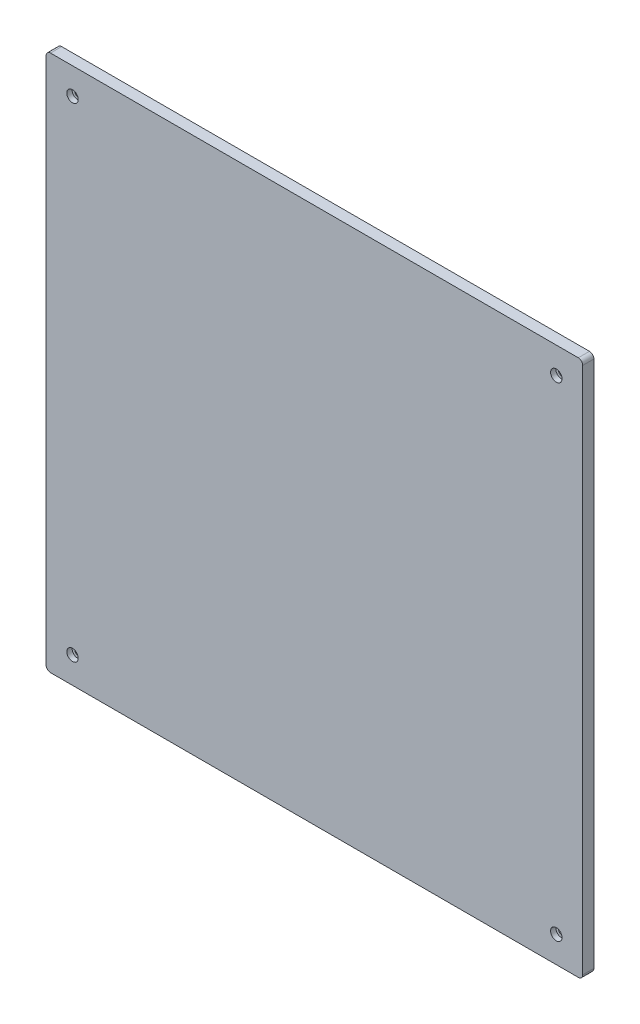
ISO-10303-21;
HEADER;
FILE_DESCRIPTION(('STEP AP214'),'2;1');
FILE_NAME('part.step','',(''),(''),'','','');
FILE_SCHEMA(('AUTOMOTIVE_DESIGN { 1 0 10303 214 1 1 1 1 }'));
ENDSEC;
DATA;
#1=APPLICATION_CONTEXT('core data for automotive mechanical design processes');
#2=APPLICATION_PROTOCOL_DEFINITION('international standard','automotive_design',2000,#1);
#3=PRODUCT_CONTEXT('',#1,'mechanical');
#4=PRODUCT('Part','Part','',(#3));
#5=PRODUCT_RELATED_PRODUCT_CATEGORY('part','',(#4));
#6=PRODUCT_DEFINITION_FORMATION('','',#4);
#7=PRODUCT_DEFINITION_CONTEXT('part definition',#1,'design');
#8=PRODUCT_DEFINITION('design','',#6,#7);
#9=PRODUCT_DEFINITION_SHAPE('','',#8);
#10=(LENGTH_UNIT() NAMED_UNIT(*) SI_UNIT(.MILLI.,.METRE.));
#11=(NAMED_UNIT(*) PLANE_ANGLE_UNIT() SI_UNIT($,.RADIAN.));
#12=(NAMED_UNIT(*) SI_UNIT($,.STERADIAN.) SOLID_ANGLE_UNIT());
#13=UNCERTAINTY_MEASURE_WITH_UNIT(LENGTH_MEASURE(1.E-05),#10,'distance_accuracy_value','');
#14=(GEOMETRIC_REPRESENTATION_CONTEXT(3) GLOBAL_UNCERTAINTY_ASSIGNED_CONTEXT((#13)) GLOBAL_UNIT_ASSIGNED_CONTEXT((#10,
#11,#12)) REPRESENTATION_CONTEXT('',''));
#15=CARTESIAN_POINT('',(0.,0.,0.));
#16=DIRECTION('',(0.,0.,1.));
#17=DIRECTION('',(1.,0.,0.));
#18=AXIS2_PLACEMENT_3D('',#15,#16,#17);
#19=CARTESIAN_POINT('',(152.4,-152.4,6.35));
#20=DIRECTION('',(-1.,0.,0.));
#21=DIRECTION('',(0.,0.,1.));
#22=AXIS2_PLACEMENT_3D('',#19,#20,#21);
#23=PLANE('',#22);
#24=DIRECTION('',(0.,1.,0.));
#25=VECTOR('',#24,1.);
#26=CARTESIAN_POINT('',(152.4,-152.4,0.));
#27=LINE('',#26,#25);
#28=CARTESIAN_POINT('',(152.4,-149.9,0.));
#29=VERTEX_POINT('',#28);
#30=CARTESIAN_POINT('',(152.4,149.9,0.));
#31=VERTEX_POINT('',#30);
#32=EDGE_CURVE('E126',#29,#31,#27,.T.);
#33=ORIENTED_EDGE('',*,*,#32,.T.);
#34=DIRECTION('',(0.,0.,-1.));
#35=VECTOR('',#34,1.);
#36=CARTESIAN_POINT('',(152.4,149.9,6.35));
#37=LINE('',#36,#35);
#38=CARTESIAN_POINT('',(152.4,149.9,6.35));
#39=VERTEX_POINT('',#38);
#40=EDGE_CURVE('E104',#31,#39,#37,.F.);
#41=ORIENTED_EDGE('',*,*,#40,.T.);
#42=DIRECTION('',(0.,1.,0.));
#43=VECTOR('',#42,1.);
#44=CARTESIAN_POINT('',(152.4,-152.4,6.35));
#45=LINE('',#44,#43);
#46=CARTESIAN_POINT('',(152.4,-149.9,6.35));
#47=VERTEX_POINT('',#46);
#48=EDGE_CURVE('E136',#47,#39,#45,.T.);
#49=ORIENTED_EDGE('',*,*,#48,.F.);
#50=DIRECTION('',(0.,0.,-1.));
#51=VECTOR('',#50,1.);
#52=CARTESIAN_POINT('',(152.4,-149.9,6.35));
#53=LINE('',#52,#51);
#54=EDGE_CURVE('E109',#47,#29,#53,.T.);
#55=ORIENTED_EDGE('',*,*,#54,.T.);
#56=EDGE_LOOP('',(#33,#41,#49,#55));
#57=FACE_BOUND('',#56,.T.);
#58=ADVANCED_FACE('F33',(#57),#23,.F.);
#59=CARTESIAN_POINT('',(-152.4,152.4,6.35));
#60=DIRECTION('',(0.,-1.,0.));
#61=DIRECTION('',(0.,0.,-1.));
#62=AXIS2_PLACEMENT_3D('',#59,#60,#61);
#63=PLANE('',#62);
#64=DIRECTION('',(-1.,0.,0.));
#65=VECTOR('',#64,1.);
#66=CARTESIAN_POINT('',(-152.4,152.4,6.35));
#67=LINE('',#66,#65);
#68=CARTESIAN_POINT('',(149.9,152.4,6.35));
#69=VERTEX_POINT('',#68);
#70=CARTESIAN_POINT('',(-149.9,152.4,6.35));
#71=VERTEX_POINT('',#70);
#72=EDGE_CURVE('E119',#69,#71,#67,.T.);
#73=ORIENTED_EDGE('',*,*,#72,.F.);
#74=DIRECTION('',(0.,0.,-1.));
#75=VECTOR('',#74,1.);
#76=CARTESIAN_POINT('',(149.9,152.4,6.35));
#77=LINE('',#76,#75);
#78=CARTESIAN_POINT('',(149.9,152.4,0.));
#79=VERTEX_POINT('',#78);
#80=EDGE_CURVE('E103',#69,#79,#77,.T.);
#81=ORIENTED_EDGE('',*,*,#80,.T.);
#82=DIRECTION('',(-1.,0.,0.));
#83=VECTOR('',#82,1.);
#84=CARTESIAN_POINT('',(-152.4,152.4,0.));
#85=LINE('',#84,#83);
#86=CARTESIAN_POINT('',(-149.9,152.4,0.));
#87=VERTEX_POINT('',#86);
#88=EDGE_CURVE('E116',#79,#87,#85,.T.);
#89=ORIENTED_EDGE('',*,*,#88,.T.);
#90=DIRECTION('',(0.,0.,-1.));
#91=VECTOR('',#90,1.);
#92=CARTESIAN_POINT('',(-149.9,152.4,6.35));
#93=LINE('',#92,#91);
#94=EDGE_CURVE('E121',#87,#71,#93,.F.);
#95=ORIENTED_EDGE('',*,*,#94,.T.);
#96=EDGE_LOOP('',(#73,#81,#89,#95));
#97=FACE_BOUND('',#96,.T.);
#98=ADVANCED_FACE('F115',(#97),#63,.F.);
#99=CARTESIAN_POINT('',(-152.4,-152.4,6.35));
#100=DIRECTION('',(1.,0.,0.));
#101=DIRECTION('',(0.,0.,-1.));
#102=AXIS2_PLACEMENT_3D('',#99,#100,#101);
#103=PLANE('',#102);
#104=DIRECTION('',(0.,-1.,0.));
#105=VECTOR('',#104,1.);
#106=CARTESIAN_POINT('',(-152.4,-152.4,0.));
#107=LINE('',#106,#105);
#108=CARTESIAN_POINT('',(-152.4,149.9,0.));
#109=VERTEX_POINT('',#108);
#110=CARTESIAN_POINT('',(-152.4,-149.9,0.));
#111=VERTEX_POINT('',#110);
#112=EDGE_CURVE('E125',#109,#111,#107,.T.);
#113=ORIENTED_EDGE('',*,*,#112,.T.);
#114=DIRECTION('',(0.,0.,-1.));
#115=VECTOR('',#114,1.);
#116=CARTESIAN_POINT('',(-152.4,-149.9,6.35));
#117=LINE('',#116,#115);
#118=CARTESIAN_POINT('',(-152.4,-149.9,6.35));
#119=VERTEX_POINT('',#118);
#120=EDGE_CURVE('E11',#111,#119,#117,.F.);
#121=ORIENTED_EDGE('',*,*,#120,.T.);
#122=DIRECTION('',(0.,-1.,0.));
#123=VECTOR('',#122,1.);
#124=CARTESIAN_POINT('',(-152.4,-152.4,6.35));
#125=LINE('',#124,#123);
#126=CARTESIAN_POINT('',(-152.4,149.9,6.35));
#127=VERTEX_POINT('',#126);
#128=EDGE_CURVE('E162',#127,#119,#125,.T.);
#129=ORIENTED_EDGE('',*,*,#128,.F.);
#130=DIRECTION('',(0.,0.,-1.));
#131=VECTOR('',#130,1.);
#132=CARTESIAN_POINT('',(-152.4,149.9,6.35));
#133=LINE('',#132,#131);
#134=EDGE_CURVE('E41',#127,#109,#133,.T.);
#135=ORIENTED_EDGE('',*,*,#134,.T.);
#136=EDGE_LOOP('',(#113,#121,#129,#135));
#137=FACE_BOUND('',#136,.T.);
#138=ADVANCED_FACE('F160',(#137),#103,.F.);
#139=CARTESIAN_POINT('',(-152.4,-152.4,6.35));
#140=DIRECTION('',(0.,1.,0.));
#141=DIRECTION('',(0.,0.,1.));
#142=AXIS2_PLACEMENT_3D('',#139,#140,#141);
#143=PLANE('',#142);
#144=DIRECTION('',(1.,0.,0.));
#145=VECTOR('',#144,1.);
#146=CARTESIAN_POINT('',(-152.4,-152.4,0.));
#147=LINE('',#146,#145);
#148=CARTESIAN_POINT('',(-149.9,-152.4,0.));
#149=VERTEX_POINT('',#148);
#150=CARTESIAN_POINT('',(149.9,-152.4,0.));
#151=VERTEX_POINT('',#150);
#152=EDGE_CURVE('E129',#149,#151,#147,.T.);
#153=ORIENTED_EDGE('',*,*,#152,.T.);
#154=DIRECTION('',(0.,0.,-1.));
#155=VECTOR('',#154,1.);
#156=CARTESIAN_POINT('',(149.9,-152.4,6.35));
#157=LINE('',#156,#155);
#158=CARTESIAN_POINT('',(149.9,-152.4,6.35));
#159=VERTEX_POINT('',#158);
#160=EDGE_CURVE('E48',#151,#159,#157,.F.);
#161=ORIENTED_EDGE('',*,*,#160,.T.);
#162=DIRECTION('',(1.,0.,0.));
#163=VECTOR('',#162,1.);
#164=CARTESIAN_POINT('',(-152.4,-152.4,6.35));
#165=LINE('',#164,#163);
#166=CARTESIAN_POINT('',(-149.9,-152.4,6.35));
#167=VERTEX_POINT('',#166);
#168=EDGE_CURVE('E137',#167,#159,#165,.T.);
#169=ORIENTED_EDGE('',*,*,#168,.F.);
#170=DIRECTION('',(0.,0.,-1.));
#171=VECTOR('',#170,1.);
#172=CARTESIAN_POINT('',(-149.9,-152.4,6.35));
#173=LINE('',#172,#171);
#174=EDGE_CURVE('E153',#167,#149,#173,.T.);
#175=ORIENTED_EDGE('',*,*,#174,.T.);
#176=EDGE_LOOP('',(#153,#161,#169,#175));
#177=FACE_BOUND('',#176,.T.);
#178=ADVANCED_FACE('F169',(#177),#143,.F.);
#179=CARTESIAN_POINT('',(0.,0.,6.35));
#180=DIRECTION('',(0.,0.,-1.));
#181=DIRECTION('',(-1.,0.,0.));
#182=AXIS2_PLACEMENT_3D('',#179,#180,#181);
#183=PLANE('',#182);
#184=CARTESIAN_POINT('',(137.4,137.4,6.35));
#185=DIRECTION('',(0.,0.,1.));
#186=DIRECTION('',(1.,0.,0.));
#187=AXIS2_PLACEMENT_3D('',#184,#185,#186);
#188=CIRCLE('',#187,3.25);
#189=CARTESIAN_POINT('',(140.65,137.4,6.35));
#190=VERTEX_POINT('',#189);
#191=EDGE_CURVE('E220',#190,#190,#188,.T.);
#192=ORIENTED_EDGE('',*,*,#191,.F.);
#193=EDGE_LOOP('',(#192));
#194=FACE_BOUND('',#193,.T.);
#195=CARTESIAN_POINT('',(-137.4,-137.4,6.35));
#196=DIRECTION('',(0.,0.,1.));
#197=DIRECTION('',(1.,0.,0.));
#198=AXIS2_PLACEMENT_3D('',#195,#196,#197);
#199=CIRCLE('',#198,3.25);
#200=CARTESIAN_POINT('',(-134.15,-137.4,6.35));
#201=VERTEX_POINT('',#200);
#202=EDGE_CURVE('E208',#201,#201,#199,.T.);
#203=ORIENTED_EDGE('',*,*,#202,.F.);
#204=EDGE_LOOP('',(#203));
#205=FACE_BOUND('',#204,.T.);
#206=CARTESIAN_POINT('',(137.4,-137.4,6.35));
#207=DIRECTION('',(0.,0.,1.));
#208=DIRECTION('',(1.,0.,0.));
#209=AXIS2_PLACEMENT_3D('',#206,#207,#208);
#210=CIRCLE('',#209,3.25);
#211=CARTESIAN_POINT('',(140.65,-137.4,6.35));
#212=VERTEX_POINT('',#211);
#213=EDGE_CURVE('E196',#212,#212,#210,.T.);
#214=ORIENTED_EDGE('',*,*,#213,.F.);
#215=EDGE_LOOP('',(#214));
#216=FACE_BOUND('',#215,.T.);
#217=CARTESIAN_POINT('',(-137.4,137.4,6.35));
#218=DIRECTION('',(0.,0.,1.));
#219=DIRECTION('',(1.,0.,0.));
#220=AXIS2_PLACEMENT_3D('',#217,#218,#219);
#221=CIRCLE('',#220,3.25);
#222=CARTESIAN_POINT('',(-134.15,137.4,6.35));
#223=VERTEX_POINT('',#222);
#224=EDGE_CURVE('E184',#223,#223,#221,.T.);
#225=ORIENTED_EDGE('',*,*,#224,.F.);
#226=EDGE_LOOP('',(#225));
#227=FACE_BOUND('',#226,.T.);
#228=ORIENTED_EDGE('',*,*,#48,.T.);
#229=CARTESIAN_POINT('',(149.9,149.9,6.35));
#230=DIRECTION('',(0.,0.,-1.));
#231=DIRECTION('',(-1.,0.,0.));
#232=AXIS2_PLACEMENT_3D('',#229,#230,#231);
#233=CIRCLE('',#232,2.5);
#234=EDGE_CURVE('E151',#39,#69,#233,.F.);
#235=ORIENTED_EDGE('',*,*,#234,.T.);
#236=ORIENTED_EDGE('',*,*,#72,.T.);
#237=CARTESIAN_POINT('',(-149.9,149.9,6.35));
#238=DIRECTION('',(0.,0.,-1.));
#239=DIRECTION('',(-1.,0.,0.));
#240=AXIS2_PLACEMENT_3D('',#237,#238,#239);
#241=CIRCLE('',#240,2.5);
#242=EDGE_CURVE('E146',#71,#127,#241,.F.);
#243=ORIENTED_EDGE('',*,*,#242,.T.);
#244=ORIENTED_EDGE('',*,*,#128,.T.);
#245=CARTESIAN_POINT('',(-149.9,-149.9,6.35));
#246=DIRECTION('',(0.,0.,-1.));
#247=DIRECTION('',(-1.,0.,0.));
#248=AXIS2_PLACEMENT_3D('',#245,#246,#247);
#249=CIRCLE('',#248,2.5);
#250=EDGE_CURVE('E55',#119,#167,#249,.F.);
#251=ORIENTED_EDGE('',*,*,#250,.T.);
#252=ORIENTED_EDGE('',*,*,#168,.T.);
#253=CARTESIAN_POINT('',(149.9,-149.9,6.35));
#254=DIRECTION('',(0.,0.,-1.));
#255=DIRECTION('',(-1.,0.,0.));
#256=AXIS2_PLACEMENT_3D('',#253,#254,#255);
#257=CIRCLE('',#256,2.5);
#258=EDGE_CURVE('E149',#159,#47,#257,.F.);
#259=ORIENTED_EDGE('',*,*,#258,.T.);
#260=EDGE_LOOP('',(#228,#235,#236,#243,#244,#251,#252,#259));
#261=FACE_BOUND('',#260,.T.);
#262=ADVANCED_FACE('F226',(#194,#205,#216,#227,#261),#183,.F.);
#263=CARTESIAN_POINT('',(0.,0.,0.));
#264=DIRECTION('',(0.,0.,-1.));
#265=DIRECTION('',(-1.,0.,0.));
#266=AXIS2_PLACEMENT_3D('',#263,#264,#265);
#267=PLANE('',#266);
#268=CARTESIAN_POINT('',(137.4,137.4,0.));
#269=DIRECTION('',(0.,0.,-1.));
#270=DIRECTION('',(-1.,0.,0.));
#271=AXIS2_PLACEMENT_3D('',#268,#269,#270);
#272=CIRCLE('',#271,1.70000000000001);
#273=CARTESIAN_POINT('',(135.7,137.4,0.));
#274=VERTEX_POINT('',#273);
#275=EDGE_CURVE('E211',#274,#274,#272,.T.);
#276=ORIENTED_EDGE('',*,*,#275,.F.);
#277=EDGE_LOOP('',(#276));
#278=FACE_BOUND('',#277,.T.);
#279=CARTESIAN_POINT('',(-137.4,-137.4,0.));
#280=DIRECTION('',(0.,0.,-1.));
#281=DIRECTION('',(-1.,0.,0.));
#282=AXIS2_PLACEMENT_3D('',#279,#280,#281);
#283=CIRCLE('',#282,1.70000000000001);
#284=CARTESIAN_POINT('',(-139.1,-137.4,0.));
#285=VERTEX_POINT('',#284);
#286=EDGE_CURVE('E199',#285,#285,#283,.T.);
#287=ORIENTED_EDGE('',*,*,#286,.F.);
#288=EDGE_LOOP('',(#287));
#289=FACE_BOUND('',#288,.T.);
#290=CARTESIAN_POINT('',(137.4,-137.4,0.));
#291=DIRECTION('',(0.,0.,-1.));
#292=DIRECTION('',(-1.,0.,0.));
#293=AXIS2_PLACEMENT_3D('',#290,#291,#292);
#294=CIRCLE('',#293,1.70000000000001);
#295=CARTESIAN_POINT('',(135.7,-137.4,0.));
#296=VERTEX_POINT('',#295);
#297=EDGE_CURVE('E187',#296,#296,#294,.T.);
#298=ORIENTED_EDGE('',*,*,#297,.F.);
#299=EDGE_LOOP('',(#298));
#300=FACE_BOUND('',#299,.T.);
#301=CARTESIAN_POINT('',(-137.4,137.4,0.));
#302=DIRECTION('',(0.,0.,-1.));
#303=DIRECTION('',(-1.,0.,0.));
#304=AXIS2_PLACEMENT_3D('',#301,#302,#303);
#305=CIRCLE('',#304,1.70000000000001);
#306=CARTESIAN_POINT('',(-139.1,137.4,0.));
#307=VERTEX_POINT('',#306);
#308=EDGE_CURVE('E131',#307,#307,#305,.T.);
#309=ORIENTED_EDGE('',*,*,#308,.F.);
#310=EDGE_LOOP('',(#309));
#311=FACE_BOUND('',#310,.T.);
#312=ORIENTED_EDGE('',*,*,#88,.F.);
#313=CARTESIAN_POINT('',(149.9,149.9,0.));
#314=DIRECTION('',(0.,0.,-1.));
#315=DIRECTION('',(-1.,0.,0.));
#316=AXIS2_PLACEMENT_3D('',#313,#314,#315);
#317=CIRCLE('',#316,2.5);
#318=EDGE_CURVE('E99',#79,#31,#317,.T.);
#319=ORIENTED_EDGE('',*,*,#318,.T.);
#320=ORIENTED_EDGE('',*,*,#32,.F.);
#321=CARTESIAN_POINT('',(149.9,-149.9,0.));
#322=DIRECTION('',(0.,0.,-1.));
#323=DIRECTION('',(-1.,0.,0.));
#324=AXIS2_PLACEMENT_3D('',#321,#322,#323);
#325=CIRCLE('',#324,2.5);
#326=EDGE_CURVE('E110',#29,#151,#325,.T.);
#327=ORIENTED_EDGE('',*,*,#326,.T.);
#328=ORIENTED_EDGE('',*,*,#152,.F.);
#329=CARTESIAN_POINT('',(-149.9,-149.9,0.));
#330=DIRECTION('',(0.,0.,-1.));
#331=DIRECTION('',(-1.,0.,0.));
#332=AXIS2_PLACEMENT_3D('',#329,#330,#331);
#333=CIRCLE('',#332,2.5);
#334=EDGE_CURVE('E140',#149,#111,#333,.T.);
#335=ORIENTED_EDGE('',*,*,#334,.T.);
#336=ORIENTED_EDGE('',*,*,#112,.F.);
#337=CARTESIAN_POINT('',(-149.9,149.9,0.));
#338=DIRECTION('',(0.,0.,-1.));
#339=DIRECTION('',(-1.,0.,0.));
#340=AXIS2_PLACEMENT_3D('',#337,#338,#339);
#341=CIRCLE('',#340,2.5);
#342=EDGE_CURVE('E120',#109,#87,#341,.T.);
#343=ORIENTED_EDGE('',*,*,#342,.T.);
#344=EDGE_LOOP('',(#312,#319,#320,#327,#328,#335,#336,#343));
#345=FACE_BOUND('',#344,.T.);
#346=ADVANCED_FACE('F123',(#278,#289,#300,#311,#345),#267,.T.);
#347=CARTESIAN_POINT('',(-137.4,137.4,6.35));
#348=DIRECTION('',(0.,0.,1.));
#349=DIRECTION('',(1.,0.,0.));
#350=AXIS2_PLACEMENT_3D('',#347,#348,#349);
#351=CYLINDRICAL_SURFACE('',#350,1.70000000000001);
#352=CARTESIAN_POINT('',(-137.4,137.4,3.35));
#353=DIRECTION('',(0.,0.,1.));
#354=DIRECTION('',(1.,0.,0.));
#355=AXIS2_PLACEMENT_3D('',#352,#353,#354);
#356=CIRCLE('',#355,1.70000000000001);
#357=CARTESIAN_POINT('',(-135.7,137.4,3.35));
#358=VERTEX_POINT('',#357);
#359=EDGE_CURVE('E178',#358,#358,#356,.T.);
#360=ORIENTED_EDGE('',*,*,#359,.T.);
#361=EDGE_LOOP('',(#360));
#362=FACE_BOUND('',#361,.T.);
#363=ORIENTED_EDGE('',*,*,#308,.T.);
#364=EDGE_LOOP('',(#363));
#365=FACE_BOUND('',#364,.T.);
#366=ADVANCED_FACE('F260',(#362,#365),#351,.F.);
#367=CARTESIAN_POINT('',(-135.7,137.4,3.35));
#368=DIRECTION('',(0.,0.,-1.));
#369=DIRECTION('',(-1.,0.,0.));
#370=AXIS2_PLACEMENT_3D('',#367,#368,#369);
#371=PLANE('',#370);
#372=ORIENTED_EDGE('',*,*,#359,.F.);
#373=EDGE_LOOP('',(#372));
#374=FACE_BOUND('',#373,.T.);
#375=CARTESIAN_POINT('',(-137.4,137.4,3.35));
#376=DIRECTION('',(0.,0.,1.));
#377=DIRECTION('',(1.,0.,0.));
#378=AXIS2_PLACEMENT_3D('',#375,#376,#377);
#379=CIRCLE('',#378,3.25);
#380=CARTESIAN_POINT('',(-134.15,137.4,3.35));
#381=VERTEX_POINT('',#380);
#382=EDGE_CURVE('E181',#381,#381,#379,.T.);
#383=ORIENTED_EDGE('',*,*,#382,.T.);
#384=EDGE_LOOP('',(#383));
#385=FACE_BOUND('',#384,.T.);
#386=ADVANCED_FACE('F265',(#374,#385),#371,.F.);
#387=CARTESIAN_POINT('',(-137.4,137.4,6.35));
#388=DIRECTION('',(0.,0.,1.));
#389=DIRECTION('',(1.,0.,0.));
#390=AXIS2_PLACEMENT_3D('',#387,#388,#389);
#391=CYLINDRICAL_SURFACE('',#390,3.25);
#392=ORIENTED_EDGE('',*,*,#382,.F.);
#393=EDGE_LOOP('',(#392));
#394=FACE_BOUND('',#393,.T.);
#395=ORIENTED_EDGE('',*,*,#224,.T.);
#396=EDGE_LOOP('',(#395));
#397=FACE_BOUND('',#396,.T.);
#398=ADVANCED_FACE('F269',(#394,#397),#391,.F.);
#399=CARTESIAN_POINT('',(137.4,-137.4,6.35));
#400=DIRECTION('',(0.,0.,1.));
#401=DIRECTION('',(1.,0.,0.));
#402=AXIS2_PLACEMENT_3D('',#399,#400,#401);
#403=CYLINDRICAL_SURFACE('',#402,1.70000000000001);
#404=CARTESIAN_POINT('',(137.4,-137.4,3.35));
#405=DIRECTION('',(0.,0.,1.));
#406=DIRECTION('',(1.,0.,0.));
#407=AXIS2_PLACEMENT_3D('',#404,#405,#406);
#408=CIRCLE('',#407,1.70000000000001);
#409=CARTESIAN_POINT('',(139.1,-137.4,3.35));
#410=VERTEX_POINT('',#409);
#411=EDGE_CURVE('E190',#410,#410,#408,.T.);
#412=ORIENTED_EDGE('',*,*,#411,.T.);
#413=EDGE_LOOP('',(#412));
#414=FACE_BOUND('',#413,.T.);
#415=ORIENTED_EDGE('',*,*,#297,.T.);
#416=EDGE_LOOP('',(#415));
#417=FACE_BOUND('',#416,.T.);
#418=ADVANCED_FACE('F273',(#414,#417),#403,.F.);
#419=CARTESIAN_POINT('',(139.1,-137.4,3.35));
#420=DIRECTION('',(0.,0.,-1.));
#421=DIRECTION('',(-1.,0.,0.));
#422=AXIS2_PLACEMENT_3D('',#419,#420,#421);
#423=PLANE('',#422);
#424=ORIENTED_EDGE('',*,*,#411,.F.);
#425=EDGE_LOOP('',(#424));
#426=FACE_BOUND('',#425,.T.);
#427=CARTESIAN_POINT('',(137.4,-137.4,3.35));
#428=DIRECTION('',(0.,0.,1.));
#429=DIRECTION('',(1.,0.,0.));
#430=AXIS2_PLACEMENT_3D('',#427,#428,#429);
#431=CIRCLE('',#430,3.25);
#432=CARTESIAN_POINT('',(140.65,-137.4,3.35));
#433=VERTEX_POINT('',#432);
#434=EDGE_CURVE('E193',#433,#433,#431,.T.);
#435=ORIENTED_EDGE('',*,*,#434,.T.);
#436=EDGE_LOOP('',(#435));
#437=FACE_BOUND('',#436,.T.);
#438=ADVANCED_FACE('F277',(#426,#437),#423,.F.);
#439=CARTESIAN_POINT('',(137.4,-137.4,6.35));
#440=DIRECTION('',(0.,0.,1.));
#441=DIRECTION('',(1.,0.,0.));
#442=AXIS2_PLACEMENT_3D('',#439,#440,#441);
#443=CYLINDRICAL_SURFACE('',#442,3.25);
#444=ORIENTED_EDGE('',*,*,#434,.F.);
#445=EDGE_LOOP('',(#444));
#446=FACE_BOUND('',#445,.T.);
#447=ORIENTED_EDGE('',*,*,#213,.T.);
#448=EDGE_LOOP('',(#447));
#449=FACE_BOUND('',#448,.T.);
#450=ADVANCED_FACE('F281',(#446,#449),#443,.F.);
#451=CARTESIAN_POINT('',(-137.4,-137.4,6.35));
#452=DIRECTION('',(0.,0.,1.));
#453=DIRECTION('',(1.,0.,0.));
#454=AXIS2_PLACEMENT_3D('',#451,#452,#453);
#455=CYLINDRICAL_SURFACE('',#454,1.70000000000001);
#456=CARTESIAN_POINT('',(-137.4,-137.4,3.35));
#457=DIRECTION('',(0.,0.,1.));
#458=DIRECTION('',(1.,0.,0.));
#459=AXIS2_PLACEMENT_3D('',#456,#457,#458);
#460=CIRCLE('',#459,1.70000000000001);
#461=CARTESIAN_POINT('',(-135.7,-137.4,3.35));
#462=VERTEX_POINT('',#461);
#463=EDGE_CURVE('E202',#462,#462,#460,.T.);
#464=ORIENTED_EDGE('',*,*,#463,.T.);
#465=EDGE_LOOP('',(#464));
#466=FACE_BOUND('',#465,.T.);
#467=ORIENTED_EDGE('',*,*,#286,.T.);
#468=EDGE_LOOP('',(#467));
#469=FACE_BOUND('',#468,.T.);
#470=ADVANCED_FACE('F285',(#466,#469),#455,.F.);
#471=CARTESIAN_POINT('',(-135.7,-137.4,3.35));
#472=DIRECTION('',(0.,0.,-1.));
#473=DIRECTION('',(-1.,0.,0.));
#474=AXIS2_PLACEMENT_3D('',#471,#472,#473);
#475=PLANE('',#474);
#476=ORIENTED_EDGE('',*,*,#463,.F.);
#477=EDGE_LOOP('',(#476));
#478=FACE_BOUND('',#477,.T.);
#479=CARTESIAN_POINT('',(-137.4,-137.4,3.35));
#480=DIRECTION('',(0.,0.,1.));
#481=DIRECTION('',(1.,0.,0.));
#482=AXIS2_PLACEMENT_3D('',#479,#480,#481);
#483=CIRCLE('',#482,3.25);
#484=CARTESIAN_POINT('',(-134.15,-137.4,3.35));
#485=VERTEX_POINT('',#484);
#486=EDGE_CURVE('E205',#485,#485,#483,.T.);
#487=ORIENTED_EDGE('',*,*,#486,.T.);
#488=EDGE_LOOP('',(#487));
#489=FACE_BOUND('',#488,.T.);
#490=ADVANCED_FACE('F289',(#478,#489),#475,.F.);
#491=CARTESIAN_POINT('',(-137.4,-137.4,6.35));
#492=DIRECTION('',(0.,0.,1.));
#493=DIRECTION('',(1.,0.,0.));
#494=AXIS2_PLACEMENT_3D('',#491,#492,#493);
#495=CYLINDRICAL_SURFACE('',#494,3.25);
#496=ORIENTED_EDGE('',*,*,#486,.F.);
#497=EDGE_LOOP('',(#496));
#498=FACE_BOUND('',#497,.T.);
#499=ORIENTED_EDGE('',*,*,#202,.T.);
#500=EDGE_LOOP('',(#499));
#501=FACE_BOUND('',#500,.T.);
#502=ADVANCED_FACE('F293',(#498,#501),#495,.F.);
#503=CARTESIAN_POINT('',(137.4,137.4,6.35));
#504=DIRECTION('',(0.,0.,1.));
#505=DIRECTION('',(1.,0.,0.));
#506=AXIS2_PLACEMENT_3D('',#503,#504,#505);
#507=CYLINDRICAL_SURFACE('',#506,1.70000000000001);
#508=CARTESIAN_POINT('',(137.4,137.4,3.35));
#509=DIRECTION('',(0.,0.,1.));
#510=DIRECTION('',(1.,0.,0.));
#511=AXIS2_PLACEMENT_3D('',#508,#509,#510);
#512=CIRCLE('',#511,1.70000000000001);
#513=CARTESIAN_POINT('',(139.1,137.4,3.35));
#514=VERTEX_POINT('',#513);
#515=EDGE_CURVE('E214',#514,#514,#512,.T.);
#516=ORIENTED_EDGE('',*,*,#515,.T.);
#517=EDGE_LOOP('',(#516));
#518=FACE_BOUND('',#517,.T.);
#519=ORIENTED_EDGE('',*,*,#275,.T.);
#520=EDGE_LOOP('',(#519));
#521=FACE_BOUND('',#520,.T.);
#522=ADVANCED_FACE('F297',(#518,#521),#507,.F.);
#523=CARTESIAN_POINT('',(139.1,137.4,3.35));
#524=DIRECTION('',(0.,0.,-1.));
#525=DIRECTION('',(-1.,0.,0.));
#526=AXIS2_PLACEMENT_3D('',#523,#524,#525);
#527=PLANE('',#526);
#528=ORIENTED_EDGE('',*,*,#515,.F.);
#529=EDGE_LOOP('',(#528));
#530=FACE_BOUND('',#529,.T.);
#531=CARTESIAN_POINT('',(137.4,137.4,3.35));
#532=DIRECTION('',(0.,0.,1.));
#533=DIRECTION('',(1.,0.,0.));
#534=AXIS2_PLACEMENT_3D('',#531,#532,#533);
#535=CIRCLE('',#534,3.25);
#536=CARTESIAN_POINT('',(140.65,137.4,3.35));
#537=VERTEX_POINT('',#536);
#538=EDGE_CURVE('E217',#537,#537,#535,.T.);
#539=ORIENTED_EDGE('',*,*,#538,.T.);
#540=EDGE_LOOP('',(#539));
#541=FACE_BOUND('',#540,.T.);
#542=ADVANCED_FACE('F301',(#530,#541),#527,.F.);
#543=CARTESIAN_POINT('',(137.4,137.4,6.35));
#544=DIRECTION('',(0.,0.,1.));
#545=DIRECTION('',(1.,0.,0.));
#546=AXIS2_PLACEMENT_3D('',#543,#544,#545);
#547=CYLINDRICAL_SURFACE('',#546,3.25);
#548=ORIENTED_EDGE('',*,*,#538,.F.);
#549=EDGE_LOOP('',(#548));
#550=FACE_BOUND('',#549,.T.);
#551=ORIENTED_EDGE('',*,*,#191,.T.);
#552=EDGE_LOOP('',(#551));
#553=FACE_BOUND('',#552,.T.);
#554=ADVANCED_FACE('F224',(#550,#553),#547,.F.);
#555=CARTESIAN_POINT('',(149.9,149.9,6.35));
#556=DIRECTION('',(0.,0.,-1.));
#557=DIRECTION('',(-1.,0.,0.));
#558=AXIS2_PLACEMENT_3D('',#555,#556,#557);
#559=CYLINDRICAL_SURFACE('',#558,2.5);
#560=ORIENTED_EDGE('',*,*,#234,.F.);
#561=ORIENTED_EDGE('',*,*,#40,.F.);
#562=ORIENTED_EDGE('',*,*,#318,.F.);
#563=ORIENTED_EDGE('',*,*,#80,.F.);
#564=EDGE_LOOP('',(#560,#561,#562,#563));
#565=FACE_BOUND('',#564,.T.);
#566=ADVANCED_FACE('F102',(#565),#559,.T.);
#567=CARTESIAN_POINT('',(149.9,-149.9,6.35));
#568=DIRECTION('',(0.,0.,-1.));
#569=DIRECTION('',(-1.,0.,0.));
#570=AXIS2_PLACEMENT_3D('',#567,#568,#569);
#571=CYLINDRICAL_SURFACE('',#570,2.5);
#572=ORIENTED_EDGE('',*,*,#258,.F.);
#573=ORIENTED_EDGE('',*,*,#160,.F.);
#574=ORIENTED_EDGE('',*,*,#326,.F.);
#575=ORIENTED_EDGE('',*,*,#54,.F.);
#576=EDGE_LOOP('',(#572,#573,#574,#575));
#577=FACE_BOUND('',#576,.T.);
#578=ADVANCED_FACE('F239',(#577),#571,.T.);
#579=CARTESIAN_POINT('',(-149.9,-149.9,6.35));
#580=DIRECTION('',(0.,0.,-1.));
#581=DIRECTION('',(-1.,0.,0.));
#582=AXIS2_PLACEMENT_3D('',#579,#580,#581);
#583=CYLINDRICAL_SURFACE('',#582,2.5);
#584=ORIENTED_EDGE('',*,*,#250,.F.);
#585=ORIENTED_EDGE('',*,*,#120,.F.);
#586=ORIENTED_EDGE('',*,*,#334,.F.);
#587=ORIENTED_EDGE('',*,*,#174,.F.);
#588=EDGE_LOOP('',(#584,#585,#586,#587));
#589=FACE_BOUND('',#588,.T.);
#590=ADVANCED_FACE('F168',(#589),#583,.T.);
#591=CARTESIAN_POINT('',(-149.9,149.9,6.35));
#592=DIRECTION('',(0.,0.,-1.));
#593=DIRECTION('',(-1.,0.,0.));
#594=AXIS2_PLACEMENT_3D('',#591,#592,#593);
#595=CYLINDRICAL_SURFACE('',#594,2.5);
#596=ORIENTED_EDGE('',*,*,#242,.F.);
#597=ORIENTED_EDGE('',*,*,#94,.F.);
#598=ORIENTED_EDGE('',*,*,#342,.F.);
#599=ORIENTED_EDGE('',*,*,#134,.F.);
#600=EDGE_LOOP('',(#596,#597,#598,#599));
#601=FACE_BOUND('',#600,.T.);
#602=ADVANCED_FACE('F35',(#601),#595,.T.);
#603=CLOSED_SHELL('',(#58,#98,#138,#178,#262,#346,#366,#386,#398,#418,#438,#450,#470,#490,#502,
#522,#542,#554,#566,#578,#590,#602));
#604=MANIFOLD_SOLID_BREP('B2',#603);
#605=ADVANCED_BREP_SHAPE_REPRESENTATION('',(#18,#604),#14);
#606=SHAPE_DEFINITION_REPRESENTATION(#9,#605);
ENDSEC;
END-ISO-10303-21;
